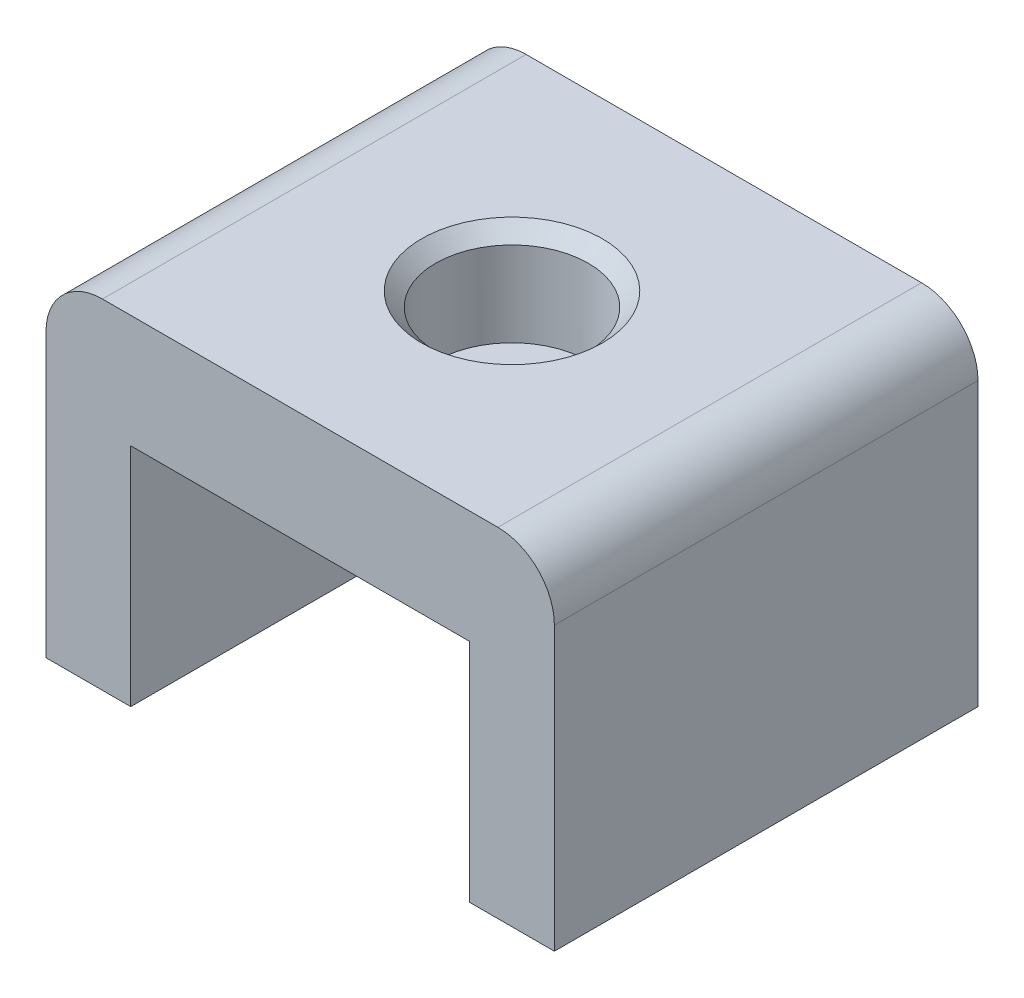
ISO-10303-21;
HEADER;
FILE_DESCRIPTION(('STEP AP214'),'2;1');
FILE_NAME('part.step','',(''),(''),'','','');
FILE_SCHEMA(('AUTOMOTIVE_DESIGN { 1 0 10303 214 1 1 1 1 }'));
ENDSEC;
DATA;
#1=APPLICATION_CONTEXT('core data for automotive mechanical design processes');
#2=APPLICATION_PROTOCOL_DEFINITION('international standard','automotive_design',2000,#1);
#3=PRODUCT_CONTEXT('',#1,'mechanical');
#4=PRODUCT('Part','Part','',(#3));
#5=PRODUCT_RELATED_PRODUCT_CATEGORY('part','',(#4));
#6=PRODUCT_DEFINITION_FORMATION('','',#4);
#7=PRODUCT_DEFINITION_CONTEXT('part definition',#1,'design');
#8=PRODUCT_DEFINITION('design','',#6,#7);
#9=PRODUCT_DEFINITION_SHAPE('','',#8);
#10=(LENGTH_UNIT() NAMED_UNIT(*) SI_UNIT(.MILLI.,.METRE.));
#11=(NAMED_UNIT(*) PLANE_ANGLE_UNIT() SI_UNIT($,.RADIAN.));
#12=(NAMED_UNIT(*) SI_UNIT($,.STERADIAN.) SOLID_ANGLE_UNIT());
#13=UNCERTAINTY_MEASURE_WITH_UNIT(LENGTH_MEASURE(1.E-05),#10,'distance_accuracy_value','');
#14=(GEOMETRIC_REPRESENTATION_CONTEXT(3) GLOBAL_UNCERTAINTY_ASSIGNED_CONTEXT((#13)) GLOBAL_UNIT_ASSIGNED_CONTEXT((#10,
#11,#12)) REPRESENTATION_CONTEXT('',''));
#15=CARTESIAN_POINT('',(0.,0.,0.));
#16=DIRECTION('',(0.,0.,1.));
#17=DIRECTION('',(1.,0.,0.));
#18=AXIS2_PLACEMENT_3D('',#15,#16,#17);
#19=CARTESIAN_POINT('',(0.,0.,15.));
#20=DIRECTION('',(-1.,0.,0.));
#21=DIRECTION('',(0.,0.,1.));
#22=AXIS2_PLACEMENT_3D('',#19,#20,#21);
#23=PLANE('',#22);
#24=DIRECTION('',(0.,1.,0.));
#25=VECTOR('',#24,1.);
#26=CARTESIAN_POINT('',(0.,0.,0.));
#27=LINE('',#26,#25);
#28=CARTESIAN_POINT('',(0.,0.,0.));
#29=VERTEX_POINT('',#28);
#30=CARTESIAN_POINT('',(0.,10.,0.));
#31=VERTEX_POINT('',#30);
#32=EDGE_CURVE('E153',#29,#31,#27,.T.);
#33=ORIENTED_EDGE('',*,*,#32,.T.);
#34=DIRECTION('',(0.,0.,-1.));
#35=VECTOR('',#34,1.);
#36=CARTESIAN_POINT('',(0.,10.,15.));
#37=LINE('',#36,#35);
#38=CARTESIAN_POINT('',(0.,10.,15.));
#39=VERTEX_POINT('',#38);
#40=EDGE_CURVE('E50',#31,#39,#37,.F.);
#41=ORIENTED_EDGE('',*,*,#40,.T.);
#42=DIRECTION('',(0.,1.,0.));
#43=VECTOR('',#42,1.);
#44=CARTESIAN_POINT('',(0.,0.,15.));
#45=LINE('',#44,#43);
#46=CARTESIAN_POINT('',(0.,0.,15.));
#47=VERTEX_POINT('',#46);
#48=EDGE_CURVE('E169',#47,#39,#45,.T.);
#49=ORIENTED_EDGE('',*,*,#48,.F.);
#50=DIRECTION('',(0.,0.,-1.));
#51=VECTOR('',#50,1.);
#52=CARTESIAN_POINT('',(0.,0.,15.));
#53=LINE('',#52,#51);
#54=EDGE_CURVE('E152',#47,#29,#53,.T.);
#55=ORIENTED_EDGE('',*,*,#54,.T.);
#56=EDGE_LOOP('',(#33,#41,#49,#55));
#57=FACE_BOUND('',#56,.T.);
#58=ADVANCED_FACE('F34',(#57),#23,.F.);
#59=CARTESIAN_POINT('',(0.,12.,15.));
#60=DIRECTION('',(0.,-1.,0.));
#61=DIRECTION('',(1.,0.,0.));
#62=AXIS2_PLACEMENT_3D('',#59,#60,#61);
#63=PLANE('',#62);
#64=CARTESIAN_POINT('',(-9.,12.,7.5));
#65=DIRECTION('',(0.,-1.,0.));
#66=DIRECTION('',(1.,0.,0.));
#67=AXIS2_PLACEMENT_3D('',#64,#65,#66);
#68=CIRCLE('',#67,3.2);
#69=CARTESIAN_POINT('',(-5.80000000000001,12.,7.5));
#70=VERTEX_POINT('',#69);
#71=EDGE_CURVE('E11',#70,#70,#68,.T.);
#72=ORIENTED_EDGE('',*,*,#71,.T.);
#73=EDGE_LOOP('',(#72));
#74=FACE_BOUND('',#73,.T.);
#75=DIRECTION('',(-1.,0.,0.));
#76=VECTOR('',#75,1.);
#77=CARTESIAN_POINT('',(0.,12.,0.));
#78=LINE('',#77,#76);
#79=CARTESIAN_POINT('',(-2.,12.,0.));
#80=VERTEX_POINT('',#79);
#81=CARTESIAN_POINT('',(-16.,12.,0.));
#82=VERTEX_POINT('',#81);
#83=EDGE_CURVE('E155',#80,#82,#78,.T.);
#84=ORIENTED_EDGE('',*,*,#83,.T.);
#85=DIRECTION('',(0.,0.,-1.));
#86=VECTOR('',#85,1.);
#87=CARTESIAN_POINT('',(-16.,12.,15.));
#88=LINE('',#87,#86);
#89=CARTESIAN_POINT('',(-16.,12.,15.));
#90=VERTEX_POINT('',#89);
#91=EDGE_CURVE('E58',#82,#90,#88,.F.);
#92=ORIENTED_EDGE('',*,*,#91,.T.);
#93=DIRECTION('',(-1.,0.,0.));
#94=VECTOR('',#93,1.);
#95=CARTESIAN_POINT('',(0.,12.,15.));
#96=LINE('',#95,#94);
#97=CARTESIAN_POINT('',(-2.,12.,15.));
#98=VERTEX_POINT('',#97);
#99=EDGE_CURVE('E126',#98,#90,#96,.T.);
#100=ORIENTED_EDGE('',*,*,#99,.F.);
#101=DIRECTION('',(0.,0.,-1.));
#102=VECTOR('',#101,1.);
#103=CARTESIAN_POINT('',(-2.,12.,15.));
#104=LINE('',#103,#102);
#105=EDGE_CURVE('E191',#98,#80,#104,.T.);
#106=ORIENTED_EDGE('',*,*,#105,.T.);
#107=EDGE_LOOP('',(#84,#92,#100,#106));
#108=FACE_BOUND('',#107,.T.);
#109=ADVANCED_FACE('F214',(#74,#108),#63,.F.);
#110=CARTESIAN_POINT('',(-18.,0.,15.));
#111=DIRECTION('',(1.,0.,0.));
#112=DIRECTION('',(0.,0.,-1.));
#113=AXIS2_PLACEMENT_3D('',#110,#111,#112);
#114=PLANE('',#113);
#115=DIRECTION('',(0.,-1.,0.));
#116=VECTOR('',#115,1.);
#117=CARTESIAN_POINT('',(-18.,0.,15.));
#118=LINE('',#117,#116);
#119=CARTESIAN_POINT('',(-18.,10.,15.));
#120=VERTEX_POINT('',#119);
#121=CARTESIAN_POINT('',(-18.,0.,15.));
#122=VERTEX_POINT('',#121);
#123=EDGE_CURVE('E115',#120,#122,#118,.T.);
#124=ORIENTED_EDGE('',*,*,#123,.F.);
#125=DIRECTION('',(0.,0.,-1.));
#126=VECTOR('',#125,1.);
#127=CARTESIAN_POINT('',(-18.,10.,15.));
#128=LINE('',#127,#126);
#129=CARTESIAN_POINT('',(-18.,10.,0.));
#130=VERTEX_POINT('',#129);
#131=EDGE_CURVE('E135',#120,#130,#128,.T.);
#132=ORIENTED_EDGE('',*,*,#131,.T.);
#133=DIRECTION('',(0.,-1.,0.));
#134=VECTOR('',#133,1.);
#135=CARTESIAN_POINT('',(-18.,0.,0.));
#136=LINE('',#135,#134);
#137=CARTESIAN_POINT('',(-18.,0.,0.));
#138=VERTEX_POINT('',#137);
#139=EDGE_CURVE('E132',#130,#138,#136,.T.);
#140=ORIENTED_EDGE('',*,*,#139,.T.);
#141=DIRECTION('',(0.,0.,-1.));
#142=VECTOR('',#141,1.);
#143=CARTESIAN_POINT('',(-18.,0.,15.));
#144=LINE('',#143,#142);
#145=EDGE_CURVE('E129',#122,#138,#144,.T.);
#146=ORIENTED_EDGE('',*,*,#145,.F.);
#147=EDGE_LOOP('',(#124,#132,#140,#146));
#148=FACE_BOUND('',#147,.T.);
#149=ADVANCED_FACE('F130',(#148),#114,.F.);
#150=CARTESIAN_POINT('',(-15.,0.,15.));
#151=DIRECTION('',(0.,1.,0.));
#152=DIRECTION('',(-1.,0.,0.));
#153=AXIS2_PLACEMENT_3D('',#150,#151,#152);
#154=PLANE('',#153);
#155=DIRECTION('',(1.,0.,0.));
#156=VECTOR('',#155,1.);
#157=CARTESIAN_POINT('',(-15.,0.,0.));
#158=LINE('',#157,#156);
#159=CARTESIAN_POINT('',(-15.,0.,0.));
#160=VERTEX_POINT('',#159);
#161=EDGE_CURVE('E159',#138,#160,#158,.T.);
#162=ORIENTED_EDGE('',*,*,#161,.T.);
#163=DIRECTION('',(0.,0.,-1.));
#164=VECTOR('',#163,1.);
#165=CARTESIAN_POINT('',(-15.,0.,15.));
#166=LINE('',#165,#164);
#167=CARTESIAN_POINT('',(-15.,0.,15.));
#168=VERTEX_POINT('',#167);
#169=EDGE_CURVE('E136',#168,#160,#166,.T.);
#170=ORIENTED_EDGE('',*,*,#169,.F.);
#171=DIRECTION('',(1.,0.,0.));
#172=VECTOR('',#171,1.);
#173=CARTESIAN_POINT('',(-15.,0.,15.));
#174=LINE('',#173,#172);
#175=EDGE_CURVE('E119',#122,#168,#174,.T.);
#176=ORIENTED_EDGE('',*,*,#175,.F.);
#177=ORIENTED_EDGE('',*,*,#145,.T.);
#178=EDGE_LOOP('',(#162,#170,#176,#177));
#179=FACE_BOUND('',#178,.T.);
#180=ADVANCED_FACE('F138',(#179),#154,.F.);
#181=CARTESIAN_POINT('',(-15.,0.,15.));
#182=DIRECTION('',(-1.,0.,0.));
#183=DIRECTION('',(0.,0.,1.));
#184=AXIS2_PLACEMENT_3D('',#181,#182,#183);
#185=PLANE('',#184);
#186=DIRECTION('',(0.,1.,0.));
#187=VECTOR('',#186,1.);
#188=CARTESIAN_POINT('',(-15.,0.,0.));
#189=LINE('',#188,#187);
#190=CARTESIAN_POINT('',(-15.,8.,0.));
#191=VERTEX_POINT('',#190);
#192=EDGE_CURVE('E161',#160,#191,#189,.T.);
#193=ORIENTED_EDGE('',*,*,#192,.T.);
#194=DIRECTION('',(0.,0.,-1.));
#195=VECTOR('',#194,1.);
#196=CARTESIAN_POINT('',(-15.,8.,15.));
#197=LINE('',#196,#195);
#198=CARTESIAN_POINT('',(-15.,8.,15.));
#199=VERTEX_POINT('',#198);
#200=EDGE_CURVE('E178',#199,#191,#197,.T.);
#201=ORIENTED_EDGE('',*,*,#200,.F.);
#202=DIRECTION('',(0.,1.,0.));
#203=VECTOR('',#202,1.);
#204=CARTESIAN_POINT('',(-15.,0.,15.));
#205=LINE('',#204,#203);
#206=EDGE_CURVE('E141',#168,#199,#205,.T.);
#207=ORIENTED_EDGE('',*,*,#206,.F.);
#208=ORIENTED_EDGE('',*,*,#169,.T.);
#209=EDGE_LOOP('',(#193,#201,#207,#208));
#210=FACE_BOUND('',#209,.T.);
#211=ADVANCED_FACE('F238',(#210),#185,.F.);
#212=CARTESIAN_POINT('',(-15.,8.,15.));
#213=DIRECTION('',(0.,1.,0.));
#214=DIRECTION('',(0.,0.,1.));
#215=AXIS2_PLACEMENT_3D('',#212,#213,#214);
#216=PLANE('',#215);
#217=CARTESIAN_POINT('',(-9.,8.,7.5));
#218=DIRECTION('',(0.,1.,0.));
#219=DIRECTION('',(0.,0.,1.));
#220=AXIS2_PLACEMENT_3D('',#217,#218,#219);
#221=CIRCLE('',#220,1.65);
#222=CARTESIAN_POINT('',(-9.,8.,9.15));
#223=VERTEX_POINT('',#222);
#224=EDGE_CURVE('E182',#223,#223,#221,.T.);
#225=ORIENTED_EDGE('',*,*,#224,.T.);
#226=EDGE_LOOP('',(#225));
#227=FACE_BOUND('',#226,.T.);
#228=DIRECTION('',(1.,0.,0.));
#229=VECTOR('',#228,1.);
#230=CARTESIAN_POINT('',(-15.,8.,0.));
#231=LINE('',#230,#229);
#232=CARTESIAN_POINT('',(-3.,8.,0.));
#233=VERTEX_POINT('',#232);
#234=EDGE_CURVE('E163',#191,#233,#231,.T.);
#235=ORIENTED_EDGE('',*,*,#234,.T.);
#236=DIRECTION('',(0.,0.,-1.));
#237=VECTOR('',#236,1.);
#238=CARTESIAN_POINT('',(-3.,8.,15.));
#239=LINE('',#238,#237);
#240=CARTESIAN_POINT('',(-3.,8.,15.));
#241=VERTEX_POINT('',#240);
#242=EDGE_CURVE('E175',#241,#233,#239,.T.);
#243=ORIENTED_EDGE('',*,*,#242,.F.);
#244=DIRECTION('',(1.,0.,0.));
#245=VECTOR('',#244,1.);
#246=CARTESIAN_POINT('',(-15.,8.,15.));
#247=LINE('',#246,#245);
#248=EDGE_CURVE('E143',#199,#241,#247,.T.);
#249=ORIENTED_EDGE('',*,*,#248,.F.);
#250=ORIENTED_EDGE('',*,*,#200,.T.);
#251=EDGE_LOOP('',(#235,#243,#249,#250));
#252=FACE_BOUND('',#251,.T.);
#253=ADVANCED_FACE('F245',(#227,#252),#216,.F.);
#254=CARTESIAN_POINT('',(-3.,0.,15.));
#255=DIRECTION('',(1.,0.,0.));
#256=DIRECTION('',(0.,0.,-1.));
#257=AXIS2_PLACEMENT_3D('',#254,#255,#256);
#258=PLANE('',#257);
#259=DIRECTION('',(0.,-1.,0.));
#260=VECTOR('',#259,1.);
#261=CARTESIAN_POINT('',(-3.,0.,0.));
#262=LINE('',#261,#260);
#263=CARTESIAN_POINT('',(-3.,0.,0.));
#264=VERTEX_POINT('',#263);
#265=EDGE_CURVE('E165',#233,#264,#262,.T.);
#266=ORIENTED_EDGE('',*,*,#265,.T.);
#267=DIRECTION('',(0.,0.,-1.));
#268=VECTOR('',#267,1.);
#269=CARTESIAN_POINT('',(-3.,0.,15.));
#270=LINE('',#269,#268);
#271=CARTESIAN_POINT('',(-3.,0.,15.));
#272=VERTEX_POINT('',#271);
#273=EDGE_CURVE('E172',#272,#264,#270,.T.);
#274=ORIENTED_EDGE('',*,*,#273,.F.);
#275=DIRECTION('',(0.,-1.,0.));
#276=VECTOR('',#275,1.);
#277=CARTESIAN_POINT('',(-3.,0.,15.));
#278=LINE('',#277,#276);
#279=EDGE_CURVE('E148',#241,#272,#278,.T.);
#280=ORIENTED_EDGE('',*,*,#279,.F.);
#281=ORIENTED_EDGE('',*,*,#242,.T.);
#282=EDGE_LOOP('',(#266,#274,#280,#281));
#283=FACE_BOUND('',#282,.T.);
#284=ADVANCED_FACE('F248',(#283),#258,.F.);
#285=CARTESIAN_POINT('',(0.,0.,15.));
#286=DIRECTION('',(0.,1.,0.));
#287=DIRECTION('',(-1.,0.,0.));
#288=AXIS2_PLACEMENT_3D('',#285,#286,#287);
#289=PLANE('',#288);
#290=DIRECTION('',(1.,0.,0.));
#291=VECTOR('',#290,1.);
#292=CARTESIAN_POINT('',(0.,0.,0.));
#293=LINE('',#292,#291);
#294=EDGE_CURVE('E167',#264,#29,#293,.T.);
#295=ORIENTED_EDGE('',*,*,#294,.T.);
#296=ORIENTED_EDGE('',*,*,#54,.F.);
#297=DIRECTION('',(1.,0.,0.));
#298=VECTOR('',#297,1.);
#299=CARTESIAN_POINT('',(0.,0.,15.));
#300=LINE('',#299,#298);
#301=EDGE_CURVE('E150',#272,#47,#300,.T.);
#302=ORIENTED_EDGE('',*,*,#301,.F.);
#303=ORIENTED_EDGE('',*,*,#273,.T.);
#304=EDGE_LOOP('',(#295,#296,#302,#303));
#305=FACE_BOUND('',#304,.T.);
#306=ADVANCED_FACE('F253',(#305),#289,.F.);
#307=CARTESIAN_POINT('',(0.,0.,15.));
#308=DIRECTION('',(0.,0.,1.));
#309=DIRECTION('',(1.,0.,0.));
#310=AXIS2_PLACEMENT_3D('',#307,#308,#309);
#311=PLANE('',#310);
#312=ORIENTED_EDGE('',*,*,#99,.T.);
#313=CARTESIAN_POINT('',(-16.,10.,15.));
#314=DIRECTION('',(0.,0.,1.));
#315=DIRECTION('',(1.,0.,0.));
#316=AXIS2_PLACEMENT_3D('',#313,#314,#315);
#317=CIRCLE('',#316,2.);
#318=EDGE_CURVE('E122',#90,#120,#317,.T.);
#319=ORIENTED_EDGE('',*,*,#318,.T.);
#320=ORIENTED_EDGE('',*,*,#123,.T.);
#321=ORIENTED_EDGE('',*,*,#175,.T.);
#322=ORIENTED_EDGE('',*,*,#206,.T.);
#323=ORIENTED_EDGE('',*,*,#248,.T.);
#324=ORIENTED_EDGE('',*,*,#279,.T.);
#325=ORIENTED_EDGE('',*,*,#301,.T.);
#326=ORIENTED_EDGE('',*,*,#48,.T.);
#327=CARTESIAN_POINT('',(-2.,10.,15.));
#328=DIRECTION('',(0.,0.,1.));
#329=DIRECTION('',(1.,0.,0.));
#330=AXIS2_PLACEMENT_3D('',#327,#328,#329);
#331=CIRCLE('',#330,2.);
#332=EDGE_CURVE('E195',#39,#98,#331,.T.);
#333=ORIENTED_EDGE('',*,*,#332,.T.);
#334=EDGE_LOOP('',(#312,#319,#320,#321,#322,#323,#324,#325,#326,#333));
#335=FACE_BOUND('',#334,.T.);
#336=ADVANCED_FACE('F117',(#335),#311,.T.);
#337=CARTESIAN_POINT('',(0.,0.,0.));
#338=DIRECTION('',(0.,0.,1.));
#339=DIRECTION('',(1.,0.,0.));
#340=AXIS2_PLACEMENT_3D('',#337,#338,#339);
#341=PLANE('',#340);
#342=ORIENTED_EDGE('',*,*,#139,.F.);
#343=CARTESIAN_POINT('',(-16.,10.,0.));
#344=DIRECTION('',(0.,0.,1.));
#345=DIRECTION('',(1.,0.,0.));
#346=AXIS2_PLACEMENT_3D('',#343,#344,#345);
#347=CIRCLE('',#346,2.);
#348=EDGE_CURVE('E189',#130,#82,#347,.F.);
#349=ORIENTED_EDGE('',*,*,#348,.T.);
#350=ORIENTED_EDGE('',*,*,#83,.F.);
#351=CARTESIAN_POINT('',(-2.,10.,0.));
#352=DIRECTION('',(0.,0.,1.));
#353=DIRECTION('',(1.,0.,0.));
#354=AXIS2_PLACEMENT_3D('',#351,#352,#353);
#355=CIRCLE('',#354,2.);
#356=EDGE_CURVE('E187',#80,#31,#355,.F.);
#357=ORIENTED_EDGE('',*,*,#356,.T.);
#358=ORIENTED_EDGE('',*,*,#32,.F.);
#359=ORIENTED_EDGE('',*,*,#294,.F.);
#360=ORIENTED_EDGE('',*,*,#265,.F.);
#361=ORIENTED_EDGE('',*,*,#234,.F.);
#362=ORIENTED_EDGE('',*,*,#192,.F.);
#363=ORIENTED_EDGE('',*,*,#161,.F.);
#364=EDGE_LOOP('',(#342,#349,#350,#357,#358,#359,#360,#361,#362,#363));
#365=FACE_BOUND('',#364,.T.);
#366=ADVANCED_FACE('F233',(#365),#341,.F.);
#367=CARTESIAN_POINT('',(-9.,8.5,7.5));
#368=DIRECTION('',(0.,1.,0.));
#369=DIRECTION('',(-1.,0.,0.));
#370=AXIS2_PLACEMENT_3D('',#367,#368,#369);
#371=CYLINDRICAL_SURFACE('',#370,2.7);
#372=CARTESIAN_POINT('',(-9.,11.5,7.5));
#373=DIRECTION('',(0.,-1.,0.));
#374=DIRECTION('',(0.,0.,-1.));
#375=AXIS2_PLACEMENT_3D('',#372,#373,#374);
#376=CIRCLE('',#375,2.7);
#377=CARTESIAN_POINT('',(-9.,11.5,4.8));
#378=VERTEX_POINT('',#377);
#379=EDGE_CURVE('E43',#378,#378,#376,.F.);
#380=ORIENTED_EDGE('',*,*,#379,.T.);
#381=EDGE_LOOP('',(#380));
#382=FACE_BOUND('',#381,.T.);
#383=CARTESIAN_POINT('',(-9.,8.5,7.5));
#384=DIRECTION('',(0.,1.,0.));
#385=DIRECTION('',(-1.,0.,0.));
#386=AXIS2_PLACEMENT_3D('',#383,#384,#385);
#387=CIRCLE('',#386,2.7);
#388=CARTESIAN_POINT('',(-11.7,8.5,7.5));
#389=VERTEX_POINT('',#388);
#390=EDGE_CURVE('E156',#389,#389,#387,.T.);
#391=ORIENTED_EDGE('',*,*,#390,.F.);
#392=EDGE_LOOP('',(#391));
#393=FACE_BOUND('',#392,.T.);
#394=ADVANCED_FACE('F201',(#382,#393),#371,.F.);
#395=CARTESIAN_POINT('',(-9.,8.5,7.5));
#396=DIRECTION('',(0.,1.,0.));
#397=DIRECTION('',(-1.,0.,0.));
#398=AXIS2_PLACEMENT_3D('',#395,#396,#397);
#399=PLANE('',#398);
#400=CARTESIAN_POINT('',(-9.,8.5,7.5));
#401=DIRECTION('',(0.,1.,0.));
#402=DIRECTION('',(-1.,0.,0.));
#403=AXIS2_PLACEMENT_3D('',#400,#401,#402);
#404=CIRCLE('',#403,1.65);
#405=CARTESIAN_POINT('',(-10.65,8.5,7.5));
#406=VERTEX_POINT('',#405);
#407=EDGE_CURVE('E185',#406,#406,#404,.T.);
#408=ORIENTED_EDGE('',*,*,#407,.F.);
#409=EDGE_LOOP('',(#408));
#410=FACE_BOUND('',#409,.T.);
#411=ORIENTED_EDGE('',*,*,#390,.T.);
#412=EDGE_LOOP('',(#411));
#413=FACE_BOUND('',#412,.T.);
#414=ADVANCED_FACE('F229',(#410,#413),#399,.T.);
#415=CARTESIAN_POINT('',(-9.,0.,7.5));
#416=DIRECTION('',(0.,1.,0.));
#417=DIRECTION('',(-1.,0.,0.));
#418=AXIS2_PLACEMENT_3D('',#415,#416,#417);
#419=CYLINDRICAL_SURFACE('',#418,1.65);
#420=ORIENTED_EDGE('',*,*,#407,.T.);
#421=EDGE_LOOP('',(#420));
#422=FACE_BOUND('',#421,.T.);
#423=ORIENTED_EDGE('',*,*,#224,.F.);
#424=EDGE_LOOP('',(#423));
#425=FACE_BOUND('',#424,.T.);
#426=ADVANCED_FACE('F224',(#422,#425),#419,.F.);
#427=CARTESIAN_POINT('',(-16.,10.,15.));
#428=DIRECTION('',(0.,0.,-1.));
#429=DIRECTION('',(-1.,0.,0.));
#430=AXIS2_PLACEMENT_3D('',#427,#428,#429);
#431=CYLINDRICAL_SURFACE('',#430,2.);
#432=ORIENTED_EDGE('',*,*,#318,.F.);
#433=ORIENTED_EDGE('',*,*,#91,.F.);
#434=ORIENTED_EDGE('',*,*,#348,.F.);
#435=ORIENTED_EDGE('',*,*,#131,.F.);
#436=EDGE_LOOP('',(#432,#433,#434,#435));
#437=FACE_BOUND('',#436,.T.);
#438=ADVANCED_FACE('F210',(#437),#431,.T.);
#439=CARTESIAN_POINT('',(-2.,10.,15.));
#440=DIRECTION('',(0.,0.,-1.));
#441=DIRECTION('',(-1.,0.,0.));
#442=AXIS2_PLACEMENT_3D('',#439,#440,#441);
#443=CYLINDRICAL_SURFACE('',#442,2.);
#444=ORIENTED_EDGE('',*,*,#332,.F.);
#445=ORIENTED_EDGE('',*,*,#40,.F.);
#446=ORIENTED_EDGE('',*,*,#356,.F.);
#447=ORIENTED_EDGE('',*,*,#105,.F.);
#448=EDGE_LOOP('',(#444,#445,#446,#447));
#449=FACE_BOUND('',#448,.T.);
#450=ADVANCED_FACE('F205',(#449),#443,.T.);
#451=CARTESIAN_POINT('',(-9.,11.5,7.5));
#452=DIRECTION('',(0.,1.,0.));
#453=DIRECTION('',(0.,0.,1.));
#454=AXIS2_PLACEMENT_3D('',#451,#452,#453);
#455=CONICAL_SURFACE('',#454,2.7,0.785398163397452);
#456=ORIENTED_EDGE('',*,*,#71,.F.);
#457=EDGE_LOOP('',(#456));
#458=FACE_BOUND('',#457,.T.);
#459=ORIENTED_EDGE('',*,*,#379,.F.);
#460=EDGE_LOOP('',(#459));
#461=FACE_BOUND('',#460,.T.);
#462=ADVANCED_FACE('F37',(#458,#461),#455,.F.);
#463=CLOSED_SHELL('',(#58,#109,#149,#180,#211,#253,#284,#306,#336,#366,#394,#414,#426,#438,#450,#462));
#464=MANIFOLD_SOLID_BREP('B2',#463);
#465=ADVANCED_BREP_SHAPE_REPRESENTATION('',(#18,#464),#14);
#466=SHAPE_DEFINITION_REPRESENTATION(#9,#465);
ENDSEC;
END-ISO-10303-21;
